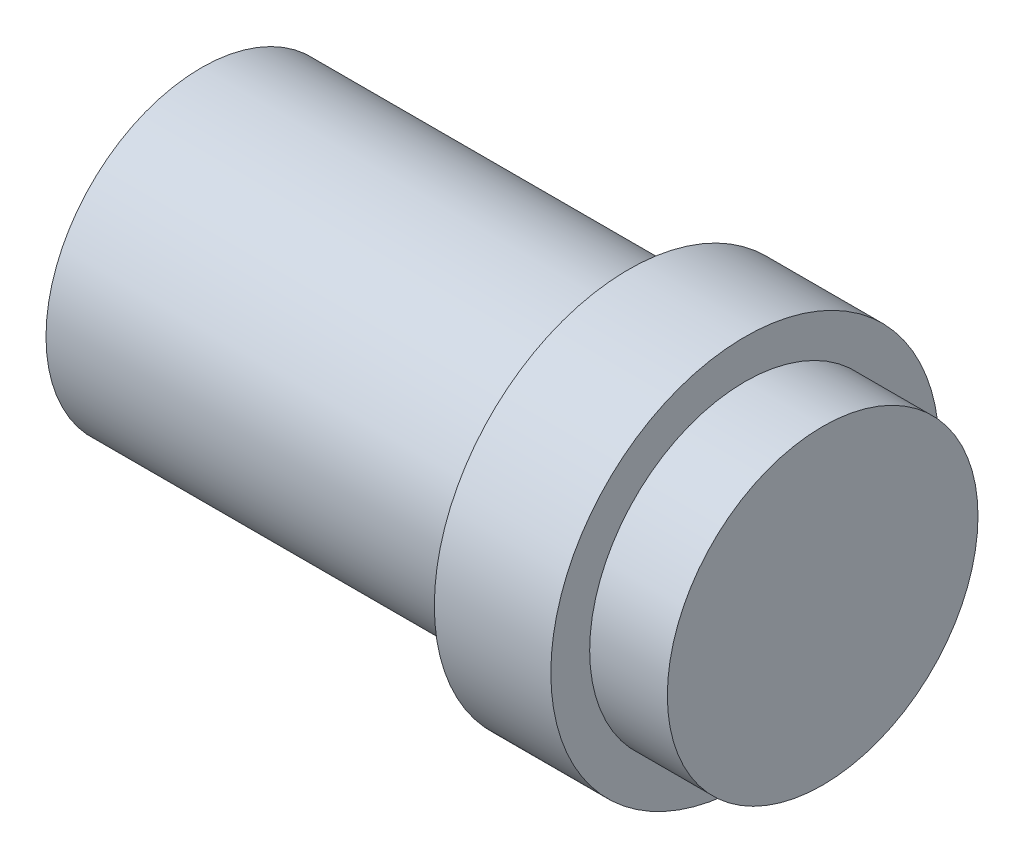
ISO-10303-21;
HEADER;
FILE_DESCRIPTION(('STEP AP214'),'2;1');
FILE_NAME('part.step','',(''),(''),'','','');
FILE_SCHEMA(('AUTOMOTIVE_DESIGN { 1 0 10303 214 1 1 1 1 }'));
ENDSEC;
DATA;
#1=APPLICATION_CONTEXT('core data for automotive mechanical design processes');
#2=APPLICATION_PROTOCOL_DEFINITION('international standard','automotive_design',2000,#1);
#3=PRODUCT_CONTEXT('',#1,'mechanical');
#4=PRODUCT('Part','Part','',(#3));
#5=PRODUCT_RELATED_PRODUCT_CATEGORY('part','',(#4));
#6=PRODUCT_DEFINITION_FORMATION('','',#4);
#7=PRODUCT_DEFINITION_CONTEXT('part definition',#1,'design');
#8=PRODUCT_DEFINITION('design','',#6,#7);
#9=PRODUCT_DEFINITION_SHAPE('','',#8);
#10=(LENGTH_UNIT() NAMED_UNIT(*) SI_UNIT(.MILLI.,.METRE.));
#11=(NAMED_UNIT(*) PLANE_ANGLE_UNIT() SI_UNIT($,.RADIAN.));
#12=(NAMED_UNIT(*) SI_UNIT($,.STERADIAN.) SOLID_ANGLE_UNIT());
#13=UNCERTAINTY_MEASURE_WITH_UNIT(LENGTH_MEASURE(1.E-05),#10,'distance_accuracy_value','');
#14=(GEOMETRIC_REPRESENTATION_CONTEXT(3) GLOBAL_UNCERTAINTY_ASSIGNED_CONTEXT((#13)) GLOBAL_UNIT_ASSIGNED_CONTEXT((#10,
#11,#12)) REPRESENTATION_CONTEXT('',''));
#15=CARTESIAN_POINT('',(0.,0.,0.));
#16=DIRECTION('',(0.,0.,1.));
#17=DIRECTION('',(1.,0.,0.));
#18=AXIS2_PLACEMENT_3D('',#15,#16,#17);
#19=CARTESIAN_POINT('',(-25.,0.,0.));
#20=DIRECTION('',(1.,0.,0.));
#21=DIRECTION('',(0.,0.,-1.));
#22=AXIS2_PLACEMENT_3D('',#19,#20,#21);
#23=PLANE('',#22);
#24=CARTESIAN_POINT('',(-25.,0.,0.));
#25=DIRECTION('',(-1.,0.,0.));
#26=DIRECTION('',(0.,0.,1.));
#27=AXIS2_PLACEMENT_3D('',#24,#25,#26);
#28=CIRCLE('',#27,8.);
#29=CARTESIAN_POINT('',(-25.,0.,8.));
#30=VERTEX_POINT('',#29);
#31=EDGE_CURVE('E10',#30,#30,#28,.T.);
#32=ORIENTED_EDGE('',*,*,#31,.T.);
#33=EDGE_LOOP('',(#32));
#34=FACE_BOUND('',#33,.T.);
#35=ADVANCED_FACE('F32',(#34),#23,.F.);
#36=CARTESIAN_POINT('',(-84.7959840628671,0.,0.));
#37=DIRECTION('',(-1.,0.,0.));
#38=DIRECTION('',(0.,0.,1.));
#39=AXIS2_PLACEMENT_3D('',#36,#37,#38);
#40=CYLINDRICAL_SURFACE('',#39,8.);
#41=ORIENTED_EDGE('',*,*,#31,.F.);
#42=EDGE_LOOP('',(#41));
#43=FACE_BOUND('',#42,.T.);
#44=CARTESIAN_POINT('',(-2.99999999999999,0.,0.));
#45=DIRECTION('',(-1.,0.,0.));
#46=DIRECTION('',(0.,0.,1.));
#47=AXIS2_PLACEMENT_3D('',#44,#45,#46);
#48=CIRCLE('',#47,8.);
#49=CARTESIAN_POINT('',(-2.99999999999999,0.,8.));
#50=VERTEX_POINT('',#49);
#51=EDGE_CURVE('E38',#50,#50,#48,.T.);
#52=ORIENTED_EDGE('',*,*,#51,.T.);
#53=EDGE_LOOP('',(#52));
#54=FACE_BOUND('',#53,.T.);
#55=ADVANCED_FACE('F70',(#43,#54),#40,.T.);
#56=CARTESIAN_POINT('',(-2.99999999999999,8.,0.));
#57=DIRECTION('',(1.,0.,0.));
#58=DIRECTION('',(0.,0.,-1.));
#59=AXIS2_PLACEMENT_3D('',#56,#57,#58);
#60=PLANE('',#59);
#61=ORIENTED_EDGE('',*,*,#51,.F.);
#62=EDGE_LOOP('',(#61));
#63=FACE_BOUND('',#62,.T.);
#64=CARTESIAN_POINT('',(-2.99999999999999,0.,0.));
#65=DIRECTION('',(-1.,0.,0.));
#66=DIRECTION('',(0.,0.,1.));
#67=AXIS2_PLACEMENT_3D('',#64,#65,#66);
#68=CIRCLE('',#67,10.);
#69=CARTESIAN_POINT('',(-2.99999999999999,0.,10.));
#70=VERTEX_POINT('',#69);
#71=EDGE_CURVE('E42',#70,#70,#68,.T.);
#72=ORIENTED_EDGE('',*,*,#71,.T.);
#73=EDGE_LOOP('',(#72));
#74=FACE_BOUND('',#73,.T.);
#75=ADVANCED_FACE('F74',(#63,#74),#60,.F.);
#76=CARTESIAN_POINT('',(-84.7959840628671,0.,0.));
#77=DIRECTION('',(-1.,0.,0.));
#78=DIRECTION('',(0.,0.,1.));
#79=AXIS2_PLACEMENT_3D('',#76,#77,#78);
#80=CYLINDRICAL_SURFACE('',#79,10.);
#81=ORIENTED_EDGE('',*,*,#71,.F.);
#82=EDGE_LOOP('',(#81));
#83=FACE_BOUND('',#82,.T.);
#84=CARTESIAN_POINT('',(3.,0.,0.));
#85=DIRECTION('',(-1.,0.,0.));
#86=DIRECTION('',(0.,0.,1.));
#87=AXIS2_PLACEMENT_3D('',#84,#85,#86);
#88=CIRCLE('',#87,10.);
#89=CARTESIAN_POINT('',(3.,0.,10.));
#90=VERTEX_POINT('',#89);
#91=EDGE_CURVE('E46',#90,#90,#88,.T.);
#92=ORIENTED_EDGE('',*,*,#91,.T.);
#93=EDGE_LOOP('',(#92));
#94=FACE_BOUND('',#93,.T.);
#95=ADVANCED_FACE('F79',(#83,#94),#80,.T.);
#96=CARTESIAN_POINT('',(3.00000000000001,10.,0.));
#97=DIRECTION('',(-1.,0.,0.));
#98=DIRECTION('',(0.,0.,1.));
#99=AXIS2_PLACEMENT_3D('',#96,#97,#98);
#100=PLANE('',#99);
#101=ORIENTED_EDGE('',*,*,#91,.F.);
#102=EDGE_LOOP('',(#101));
#103=FACE_BOUND('',#102,.T.);
#104=CARTESIAN_POINT('',(3.,0.,0.));
#105=DIRECTION('',(-1.,0.,0.));
#106=DIRECTION('',(0.,0.,1.));
#107=AXIS2_PLACEMENT_3D('',#104,#105,#106);
#108=CIRCLE('',#107,8.);
#109=CARTESIAN_POINT('',(3.,0.,8.));
#110=VERTEX_POINT('',#109);
#111=EDGE_CURVE('E51',#110,#110,#108,.T.);
#112=ORIENTED_EDGE('',*,*,#111,.T.);
#113=EDGE_LOOP('',(#112));
#114=FACE_BOUND('',#113,.T.);
#115=ADVANCED_FACE('F66',(#103,#114),#100,.F.);
#116=CARTESIAN_POINT('',(-84.7959840628671,0.,0.));
#117=DIRECTION('',(-1.,0.,0.));
#118=DIRECTION('',(0.,0.,1.));
#119=AXIS2_PLACEMENT_3D('',#116,#117,#118);
#120=CYLINDRICAL_SURFACE('',#119,8.);
#121=ORIENTED_EDGE('',*,*,#111,.F.);
#122=EDGE_LOOP('',(#121));
#123=FACE_BOUND('',#122,.T.);
#124=CARTESIAN_POINT('',(7.00000000000001,0.,0.));
#125=DIRECTION('',(-1.,0.,0.));
#126=DIRECTION('',(0.,0.,1.));
#127=AXIS2_PLACEMENT_3D('',#124,#125,#126);
#128=CIRCLE('',#127,8.);
#129=CARTESIAN_POINT('',(7.00000000000001,0.,8.));
#130=VERTEX_POINT('',#129);
#131=EDGE_CURVE('E54',#130,#130,#128,.T.);
#132=ORIENTED_EDGE('',*,*,#131,.T.);
#133=EDGE_LOOP('',(#132));
#134=FACE_BOUND('',#133,.T.);
#135=ADVANCED_FACE('F58',(#123,#134),#120,.T.);
#136=CARTESIAN_POINT('',(7.00000000000001,8.,0.));
#137=DIRECTION('',(-1.,0.,0.));
#138=DIRECTION('',(0.,0.,1.));
#139=AXIS2_PLACEMENT_3D('',#136,#137,#138);
#140=PLANE('',#139);
#141=ORIENTED_EDGE('',*,*,#131,.F.);
#142=EDGE_LOOP('',(#141));
#143=FACE_BOUND('',#142,.T.);
#144=ADVANCED_FACE('F60',(#143),#140,.F.);
#145=CLOSED_SHELL('',(#35,#55,#75,#95,#115,#135,#144));
#146=MANIFOLD_SOLID_BREP('B2',#145);
#147=ADVANCED_BREP_SHAPE_REPRESENTATION('',(#18,#146),#14);
#148=SHAPE_DEFINITION_REPRESENTATION(#9,#147);
ENDSEC;
END-ISO-10303-21;
